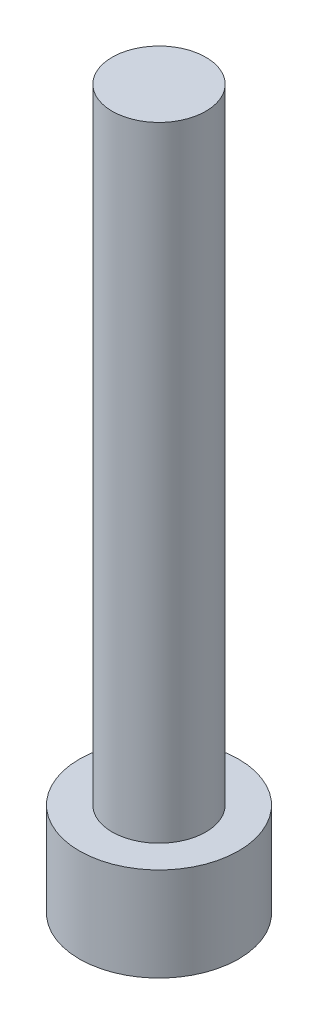
ISO-10303-21;
HEADER;
FILE_DESCRIPTION(('STEP AP214'),'2;1');
FILE_NAME('part.step','',(''),(''),'','','');
FILE_SCHEMA(('AUTOMOTIVE_DESIGN { 1 0 10303 214 1 1 1 1 }'));
ENDSEC;
DATA;
#1=APPLICATION_CONTEXT('core data for automotive mechanical design processes');
#2=APPLICATION_PROTOCOL_DEFINITION('international standard','automotive_design',2000,#1);
#3=PRODUCT_CONTEXT('',#1,'mechanical');
#4=PRODUCT('Part','Part','',(#3));
#5=PRODUCT_RELATED_PRODUCT_CATEGORY('part','',(#4));
#6=PRODUCT_DEFINITION_FORMATION('','',#4);
#7=PRODUCT_DEFINITION_CONTEXT('part definition',#1,'design');
#8=PRODUCT_DEFINITION('design','',#6,#7);
#9=PRODUCT_DEFINITION_SHAPE('','',#8);
#10=(LENGTH_UNIT() NAMED_UNIT(*) SI_UNIT(.MILLI.,.METRE.));
#11=(NAMED_UNIT(*) PLANE_ANGLE_UNIT() SI_UNIT($,.RADIAN.));
#12=(NAMED_UNIT(*) SI_UNIT($,.STERADIAN.) SOLID_ANGLE_UNIT());
#13=UNCERTAINTY_MEASURE_WITH_UNIT(LENGTH_MEASURE(1.E-05),#10,'distance_accuracy_value','');
#14=(GEOMETRIC_REPRESENTATION_CONTEXT(3) GLOBAL_UNCERTAINTY_ASSIGNED_CONTEXT((#13)) GLOBAL_UNIT_ASSIGNED_CONTEXT((#10,
#11,#12)) REPRESENTATION_CONTEXT('',''));
#15=CARTESIAN_POINT('',(0.,0.,0.));
#16=DIRECTION('',(0.,0.,1.));
#17=DIRECTION('',(1.,0.,0.));
#18=AXIS2_PLACEMENT_3D('',#15,#16,#17);
#19=CARTESIAN_POINT('',(0.,6.,0.));
#20=DIRECTION('',(0.,-1.,0.));
#21=DIRECTION('',(0.,0.,-1.));
#22=AXIS2_PLACEMENT_3D('',#19,#20,#21);
#23=CYLINDRICAL_SURFACE('',#22,5.1);
#24=CARTESIAN_POINT('',(0.,6.,0.));
#25=DIRECTION('',(0.,1.,0.));
#26=DIRECTION('',(0.,0.,1.));
#27=AXIS2_PLACEMENT_3D('',#24,#25,#26);
#28=CIRCLE('',#27,5.1);
#29=CARTESIAN_POINT('',(0.,6.,5.1));
#30=VERTEX_POINT('',#29);
#31=EDGE_CURVE('E45',#30,#30,#28,.T.);
#32=ORIENTED_EDGE('',*,*,#31,.F.);
#33=EDGE_LOOP('',(#32));
#34=FACE_BOUND('',#33,.T.);
#35=CARTESIAN_POINT('',(0.,0.,0.));
#36=DIRECTION('',(0.,1.,0.));
#37=DIRECTION('',(0.,0.,1.));
#38=AXIS2_PLACEMENT_3D('',#35,#36,#37);
#39=CIRCLE('',#38,5.1);
#40=CARTESIAN_POINT('',(0.,0.,5.1));
#41=VERTEX_POINT('',#40);
#42=EDGE_CURVE('E40',#41,#41,#39,.T.);
#43=ORIENTED_EDGE('',*,*,#42,.T.);
#44=EDGE_LOOP('',(#43));
#45=FACE_BOUND('',#44,.T.);
#46=ADVANCED_FACE('F37',(#34,#45),#23,.T.);
#47=CARTESIAN_POINT('',(0.,6.,0.));
#48=DIRECTION('',(0.,1.,0.));
#49=DIRECTION('',(0.,0.,1.));
#50=AXIS2_PLACEMENT_3D('',#47,#48,#49);
#51=PLANE('',#50);
#52=CARTESIAN_POINT('',(0.,6.,0.));
#53=DIRECTION('',(0.,1.,0.));
#54=DIRECTION('',(0.,0.,1.));
#55=AXIS2_PLACEMENT_3D('',#52,#53,#54);
#56=CIRCLE('',#55,3.);
#57=CARTESIAN_POINT('',(0.,6.,3.));
#58=VERTEX_POINT('',#57);
#59=EDGE_CURVE('E10',#58,#58,#56,.T.);
#60=ORIENTED_EDGE('',*,*,#59,.F.);
#61=EDGE_LOOP('',(#60));
#62=FACE_BOUND('',#61,.T.);
#63=ORIENTED_EDGE('',*,*,#31,.T.);
#64=EDGE_LOOP('',(#63));
#65=FACE_BOUND('',#64,.T.);
#66=ADVANCED_FACE('F65',(#62,#65),#51,.T.);
#67=CARTESIAN_POINT('',(0.,0.,0.));
#68=DIRECTION('',(0.,1.,0.));
#69=DIRECTION('',(0.,0.,1.));
#70=AXIS2_PLACEMENT_3D('',#67,#68,#69);
#71=PLANE('',#70);
#72=ORIENTED_EDGE('',*,*,#42,.F.);
#73=EDGE_LOOP('',(#72));
#74=FACE_BOUND('',#73,.T.);
#75=ADVANCED_FACE('F62',(#74),#71,.F.);
#76=CARTESIAN_POINT('',(0.,46.,0.));
#77=DIRECTION('',(0.,-1.,0.));
#78=DIRECTION('',(0.,0.,-1.));
#79=AXIS2_PLACEMENT_3D('',#76,#77,#78);
#80=CYLINDRICAL_SURFACE('',#79,3.);
#81=CARTESIAN_POINT('',(0.,46.,0.));
#82=DIRECTION('',(0.,1.,0.));
#83=DIRECTION('',(0.,0.,1.));
#84=AXIS2_PLACEMENT_3D('',#81,#82,#83);
#85=CIRCLE('',#84,3.);
#86=CARTESIAN_POINT('',(0.,46.,3.));
#87=VERTEX_POINT('',#86);
#88=EDGE_CURVE('E52',#87,#87,#85,.T.);
#89=ORIENTED_EDGE('',*,*,#88,.F.);
#90=EDGE_LOOP('',(#89));
#91=FACE_BOUND('',#90,.T.);
#92=ORIENTED_EDGE('',*,*,#59,.T.);
#93=EDGE_LOOP('',(#92));
#94=FACE_BOUND('',#93,.T.);
#95=ADVANCED_FACE('F64',(#91,#94),#80,.T.);
#96=CARTESIAN_POINT('',(0.,46.,0.));
#97=DIRECTION('',(0.,1.,0.));
#98=DIRECTION('',(0.,0.,1.));
#99=AXIS2_PLACEMENT_3D('',#96,#97,#98);
#100=PLANE('',#99);
#101=ORIENTED_EDGE('',*,*,#88,.T.);
#102=EDGE_LOOP('',(#101));
#103=FACE_BOUND('',#102,.T.);
#104=ADVANCED_FACE('F70',(#103),#100,.T.);
#105=CLOSED_SHELL('',(#46,#66,#75,#95,#104));
#106=MANIFOLD_SOLID_BREP('B2',#105);
#107=ADVANCED_BREP_SHAPE_REPRESENTATION('',(#18,#106),#14);
#108=SHAPE_DEFINITION_REPRESENTATION(#9,#107);
ENDSEC;
END-ISO-10303-21;
